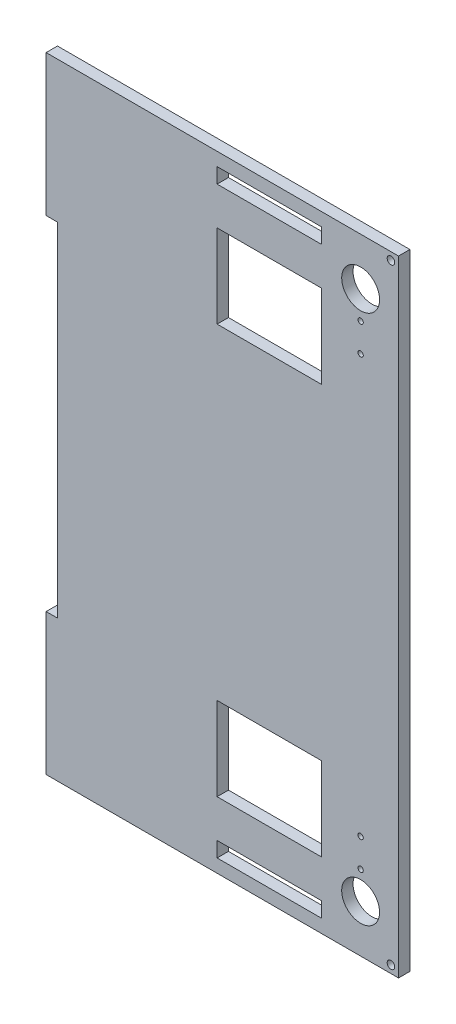
ISO-10303-21;
HEADER;
FILE_DESCRIPTION(('STEP AP214'),'2;1');
FILE_NAME('part.step','',(''),(''),'','','');
FILE_SCHEMA(('AUTOMOTIVE_DESIGN { 1 0 10303 214 1 1 1 1 }'));
ENDSEC;
DATA;
#1=APPLICATION_CONTEXT('core data for automotive mechanical design processes');
#2=APPLICATION_PROTOCOL_DEFINITION('international standard','automotive_design',2000,#1);
#3=PRODUCT_CONTEXT('',#1,'mechanical');
#4=PRODUCT('Part','Part','',(#3));
#5=PRODUCT_RELATED_PRODUCT_CATEGORY('part','',(#4));
#6=PRODUCT_DEFINITION_FORMATION('','',#4);
#7=PRODUCT_DEFINITION_CONTEXT('part definition',#1,'design');
#8=PRODUCT_DEFINITION('design','',#6,#7);
#9=PRODUCT_DEFINITION_SHAPE('','',#8);
#10=(LENGTH_UNIT() NAMED_UNIT(*) SI_UNIT(.MILLI.,.METRE.));
#11=(NAMED_UNIT(*) PLANE_ANGLE_UNIT() SI_UNIT($,.RADIAN.));
#12=(NAMED_UNIT(*) SI_UNIT($,.STERADIAN.) SOLID_ANGLE_UNIT());
#13=UNCERTAINTY_MEASURE_WITH_UNIT(LENGTH_MEASURE(1.E-05),#10,'distance_accuracy_value','');
#14=(GEOMETRIC_REPRESENTATION_CONTEXT(3) GLOBAL_UNCERTAINTY_ASSIGNED_CONTEXT((#13)) GLOBAL_UNIT_ASSIGNED_CONTEXT((#10,
#11,#12)) REPRESENTATION_CONTEXT('',''));
#15=CARTESIAN_POINT('',(0.,0.,0.));
#16=DIRECTION('',(0.,0.,1.));
#17=DIRECTION('',(1.,0.,0.));
#18=AXIS2_PLACEMENT_3D('',#15,#16,#17);
#19=CARTESIAN_POINT('',(-186.,0.,6.));
#20=DIRECTION('',(1.,0.,0.));
#21=DIRECTION('',(0.,1.,0.));
#22=AXIS2_PLACEMENT_3D('',#19,#20,#21);
#23=PLANE('',#22);
#24=DIRECTION('',(0.,-1.,0.));
#25=VECTOR('',#24,1.);
#26=CARTESIAN_POINT('',(-186.,0.,6.));
#27=LINE('',#26,#25);
#28=CARTESIAN_POINT('',(-186.,74.5,6.));
#29=VERTEX_POINT('',#28);
#30=CARTESIAN_POINT('',(-186.,0.,6.));
#31=VERTEX_POINT('',#30);
#32=EDGE_CURVE('E220',#29,#31,#27,.T.);
#33=ORIENTED_EDGE('',*,*,#32,.F.);
#34=DIRECTION('',(0.,0.,-1.));
#35=VECTOR('',#34,1.);
#36=CARTESIAN_POINT('',(-186.,74.5,6.));
#37=LINE('',#36,#35);
#38=CARTESIAN_POINT('',(-186.,74.5,0.));
#39=VERTEX_POINT('',#38);
#40=EDGE_CURVE('E258',#29,#39,#37,.T.);
#41=ORIENTED_EDGE('',*,*,#40,.T.);
#42=DIRECTION('',(0.,-1.,0.));
#43=VECTOR('',#42,1.);
#44=CARTESIAN_POINT('',(-186.,0.,0.));
#45=LINE('',#44,#43);
#46=CARTESIAN_POINT('',(-186.,0.,0.));
#47=VERTEX_POINT('',#46);
#48=EDGE_CURVE('E233',#39,#47,#45,.T.);
#49=ORIENTED_EDGE('',*,*,#48,.T.);
#50=DIRECTION('',(0.,0.,-1.));
#51=VECTOR('',#50,1.);
#52=CARTESIAN_POINT('',(-186.,0.,6.));
#53=LINE('',#52,#51);
#54=EDGE_CURVE('E240',#31,#47,#53,.T.);
#55=ORIENTED_EDGE('',*,*,#54,.F.);
#56=EDGE_LOOP('',(#33,#41,#49,#55));
#57=FACE_BOUND('',#56,.T.);
#58=ADVANCED_FACE('F33',(#57),#23,.F.);
#59=CARTESIAN_POINT('',(0.,0.,6.));
#60=DIRECTION('',(-1.,0.,0.));
#61=DIRECTION('',(0.,0.,1.));
#62=AXIS2_PLACEMENT_3D('',#59,#60,#61);
#63=PLANE('',#62);
#64=DIRECTION('',(0.,1.,0.));
#65=VECTOR('',#64,1.);
#66=CARTESIAN_POINT('',(0.,0.,0.));
#67=LINE('',#66,#65);
#68=CARTESIAN_POINT('',(0.,0.,0.));
#69=VERTEX_POINT('',#68);
#70=CARTESIAN_POINT('',(0.,330.,0.));
#71=VERTEX_POINT('',#70);
#72=EDGE_CURVE('E227',#69,#71,#67,.T.);
#73=ORIENTED_EDGE('',*,*,#72,.T.);
#74=DIRECTION('',(0.,0.,-1.));
#75=VECTOR('',#74,1.);
#76=CARTESIAN_POINT('',(0.,330.,6.));
#77=LINE('',#76,#75);
#78=CARTESIAN_POINT('',(0.,330.,6.));
#79=VERTEX_POINT('',#78);
#80=EDGE_CURVE('E11',#79,#71,#77,.T.);
#81=ORIENTED_EDGE('',*,*,#80,.F.);
#82=DIRECTION('',(0.,1.,0.));
#83=VECTOR('',#82,1.);
#84=CARTESIAN_POINT('',(0.,0.,6.));
#85=LINE('',#84,#83);
#86=CARTESIAN_POINT('',(0.,0.,6.));
#87=VERTEX_POINT('',#86);
#88=EDGE_CURVE('E237',#87,#79,#85,.T.);
#89=ORIENTED_EDGE('',*,*,#88,.F.);
#90=DIRECTION('',(0.,0.,-1.));
#91=VECTOR('',#90,1.);
#92=CARTESIAN_POINT('',(0.,0.,6.));
#93=LINE('',#92,#91);
#94=EDGE_CURVE('E222',#87,#69,#93,.T.);
#95=ORIENTED_EDGE('',*,*,#94,.T.);
#96=EDGE_LOOP('',(#73,#81,#89,#95));
#97=FACE_BOUND('',#96,.T.);
#98=ADVANCED_FACE('F35',(#97),#63,.F.);
#99=CARTESIAN_POINT('',(0.,330.,6.));
#100=DIRECTION('',(0.,-1.,0.));
#101=DIRECTION('',(1.,0.,0.));
#102=AXIS2_PLACEMENT_3D('',#99,#100,#101);
#103=PLANE('',#102);
#104=DIRECTION('',(-1.,0.,0.));
#105=VECTOR('',#104,1.);
#106=CARTESIAN_POINT('',(0.,330.,0.));
#107=LINE('',#106,#105);
#108=CARTESIAN_POINT('',(-186.,330.,0.));
#109=VERTEX_POINT('',#108);
#110=EDGE_CURVE('E230',#71,#109,#107,.T.);
#111=ORIENTED_EDGE('',*,*,#110,.T.);
#112=DIRECTION('',(0.,0.,-1.));
#113=VECTOR('',#112,1.);
#114=CARTESIAN_POINT('',(-186.,330.,6.));
#115=LINE('',#114,#113);
#116=CARTESIAN_POINT('',(-186.,330.,6.));
#117=VERTEX_POINT('',#116);
#118=EDGE_CURVE('E41',#117,#109,#115,.T.);
#119=ORIENTED_EDGE('',*,*,#118,.F.);
#120=DIRECTION('',(-1.,0.,0.));
#121=VECTOR('',#120,1.);
#122=CARTESIAN_POINT('',(0.,330.,6.));
#123=LINE('',#122,#121);
#124=EDGE_CURVE('E217',#79,#117,#123,.T.);
#125=ORIENTED_EDGE('',*,*,#124,.F.);
#126=ORIENTED_EDGE('',*,*,#80,.T.);
#127=EDGE_LOOP('',(#111,#119,#125,#126));
#128=FACE_BOUND('',#127,.T.);
#129=ADVANCED_FACE('F441',(#128),#103,.F.);
#130=CARTESIAN_POINT('',(-186.,255.5,0.));
#131=VERTEX_POINT('',#130);
#132=EDGE_CURVE('E210',#109,#131,#45,.T.);
#133=ORIENTED_EDGE('',*,*,#132,.T.);
#134=DIRECTION('',(0.,0.,-1.));
#135=VECTOR('',#134,1.);
#136=CARTESIAN_POINT('',(-186.,255.5,6.));
#137=LINE('',#136,#135);
#138=CARTESIAN_POINT('',(-186.,255.5,6.));
#139=VERTEX_POINT('',#138);
#140=EDGE_CURVE('E48',#139,#131,#137,.T.);
#141=ORIENTED_EDGE('',*,*,#140,.F.);
#142=EDGE_CURVE('E208',#117,#139,#27,.T.);
#143=ORIENTED_EDGE('',*,*,#142,.F.);
#144=ORIENTED_EDGE('',*,*,#118,.T.);
#145=EDGE_LOOP('',(#133,#141,#143,#144));
#146=FACE_BOUND('',#145,.T.);
#147=ADVANCED_FACE('F206',(#146),#23,.F.);
#148=CARTESIAN_POINT('',(0.,0.,6.));
#149=DIRECTION('',(0.,1.,0.));
#150=DIRECTION('',(-1.,0.,0.));
#151=AXIS2_PLACEMENT_3D('',#148,#149,#150);
#152=PLANE('',#151);
#153=DIRECTION('',(1.,0.,0.));
#154=VECTOR('',#153,1.);
#155=CARTESIAN_POINT('',(0.,0.,0.));
#156=LINE('',#155,#154);
#157=EDGE_CURVE('E235',#47,#69,#156,.T.);
#158=ORIENTED_EDGE('',*,*,#157,.T.);
#159=ORIENTED_EDGE('',*,*,#94,.F.);
#160=DIRECTION('',(1.,0.,0.));
#161=VECTOR('',#160,1.);
#162=CARTESIAN_POINT('',(0.,0.,6.));
#163=LINE('',#162,#161);
#164=EDGE_CURVE('E219',#31,#87,#163,.T.);
#165=ORIENTED_EDGE('',*,*,#164,.F.);
#166=ORIENTED_EDGE('',*,*,#54,.T.);
#167=EDGE_LOOP('',(#158,#159,#165,#166));
#168=FACE_BOUND('',#167,.T.);
#169=ADVANCED_FACE('F447',(#168),#152,.F.);
#170=CARTESIAN_POINT('',(0.,0.,6.));
#171=DIRECTION('',(0.,0.,1.));
#172=DIRECTION('',(1.,0.,0.));
#173=AXIS2_PLACEMENT_3D('',#170,#171,#172);
#174=PLANE('',#173);
#175=DIRECTION('',(-1.,0.,0.));
#176=VECTOR('',#175,1.);
#177=CARTESIAN_POINT('',(-186.,74.5,6.));
#178=LINE('',#177,#176);
#179=CARTESIAN_POINT('',(-180.,74.5,6.));
#180=VERTEX_POINT('',#179);
#181=EDGE_CURVE('E211',#180,#29,#178,.T.);
#182=ORIENTED_EDGE('',*,*,#181,.T.);
#183=ORIENTED_EDGE('',*,*,#32,.T.);
#184=ORIENTED_EDGE('',*,*,#164,.T.);
#185=ORIENTED_EDGE('',*,*,#88,.T.);
#186=ORIENTED_EDGE('',*,*,#124,.T.);
#187=ORIENTED_EDGE('',*,*,#142,.T.);
#188=DIRECTION('',(1.,0.,0.));
#189=VECTOR('',#188,1.);
#190=CARTESIAN_POINT('',(-186.,255.5,6.));
#191=LINE('',#190,#189);
#192=CARTESIAN_POINT('',(-180.,255.5,6.));
#193=VERTEX_POINT('',#192);
#194=EDGE_CURVE('E193',#139,#193,#191,.T.);
#195=ORIENTED_EDGE('',*,*,#194,.T.);
#196=DIRECTION('',(0.,-1.,0.));
#197=VECTOR('',#196,1.);
#198=CARTESIAN_POINT('',(-180.,74.5,6.));
#199=LINE('',#198,#197);
#200=EDGE_CURVE('E200',#193,#180,#199,.T.);
#201=ORIENTED_EDGE('',*,*,#200,.T.);
#202=EDGE_LOOP('',(#182,#183,#184,#185,#186,#187,#195,#201));
#203=FACE_BOUND('',#202,.T.);
#204=DIRECTION('',(1.,0.,0.));
#205=VECTOR('',#204,1.);
#206=CARTESIAN_POINT('',(-95.75,315.,6.));
#207=LINE('',#206,#205);
#208=CARTESIAN_POINT('',(-95.75,315.,6.));
#209=VERTEX_POINT('',#208);
#210=CARTESIAN_POINT('',(-40.75,315.,6.));
#211=VERTEX_POINT('',#210);
#212=EDGE_CURVE('E56',#209,#211,#207,.T.);
#213=ORIENTED_EDGE('',*,*,#212,.F.);
#214=DIRECTION('',(0.,-1.,0.));
#215=VECTOR('',#214,1.);
#216=CARTESIAN_POINT('',(-95.75,315.,6.));
#217=LINE('',#216,#215);
#218=CARTESIAN_POINT('',(-95.75,323.,6.));
#219=VERTEX_POINT('',#218);
#220=EDGE_CURVE('E268',#219,#209,#217,.T.);
#221=ORIENTED_EDGE('',*,*,#220,.F.);
#222=DIRECTION('',(-1.,0.,0.));
#223=VECTOR('',#222,1.);
#224=CARTESIAN_POINT('',(-95.75,323.,6.));
#225=LINE('',#224,#223);
#226=CARTESIAN_POINT('',(-40.75,323.,6.));
#227=VERTEX_POINT('',#226);
#228=EDGE_CURVE('E282',#227,#219,#225,.T.);
#229=ORIENTED_EDGE('',*,*,#228,.F.);
#230=DIRECTION('',(0.,1.,0.));
#231=VECTOR('',#230,1.);
#232=CARTESIAN_POINT('',(-40.75,315.,6.));
#233=LINE('',#232,#231);
#234=EDGE_CURVE('E279',#211,#227,#233,.T.);
#235=ORIENTED_EDGE('',*,*,#234,.F.);
#236=EDGE_LOOP('',(#213,#221,#229,#235));
#237=FACE_BOUND('',#236,.T.);
#238=CARTESIAN_POINT('',(-20.,305.,6.));
#239=DIRECTION('',(0.,0.,1.));
#240=DIRECTION('',(-1.,0.,0.));
#241=AXIS2_PLACEMENT_3D('',#238,#239,#240);
#242=CIRCLE('',#241,10.);
#243=CARTESIAN_POINT('',(-30.,305.,6.));
#244=VERTEX_POINT('',#243);
#245=EDGE_CURVE('E289',#244,#244,#242,.T.);
#246=ORIENTED_EDGE('',*,*,#245,.F.);
#247=EDGE_LOOP('',(#246));
#248=FACE_BOUND('',#247,.T.);
#249=CARTESIAN_POINT('',(-4.,326.,6.));
#250=DIRECTION('',(0.,0.,1.));
#251=DIRECTION('',(-1.,0.,0.));
#252=AXIS2_PLACEMENT_3D('',#249,#250,#251);
#253=CIRCLE('',#252,2.);
#254=CARTESIAN_POINT('',(-6.,326.,6.));
#255=VERTEX_POINT('',#254);
#256=EDGE_CURVE('E298',#255,#255,#253,.T.);
#257=ORIENTED_EDGE('',*,*,#256,.F.);
#258=EDGE_LOOP('',(#257));
#259=FACE_BOUND('',#258,.T.);
#260=CARTESIAN_POINT('',(-20.,290.27,6.));
#261=DIRECTION('',(0.,0.,1.));
#262=DIRECTION('',(-1.,0.,0.));
#263=AXIS2_PLACEMENT_3D('',#260,#261,#262);
#264=CIRCLE('',#263,1.4);
#265=CARTESIAN_POINT('',(-21.4,290.27,6.));
#266=VERTEX_POINT('',#265);
#267=EDGE_CURVE('E304',#266,#266,#264,.T.);
#268=ORIENTED_EDGE('',*,*,#267,.F.);
#269=EDGE_LOOP('',(#268));
#270=FACE_BOUND('',#269,.T.);
#271=CARTESIAN_POINT('',(-20.,275.27,6.));
#272=DIRECTION('',(0.,0.,1.));
#273=DIRECTION('',(-1.,0.,0.));
#274=AXIS2_PLACEMENT_3D('',#271,#272,#273);
#275=CIRCLE('',#274,1.4);
#276=CARTESIAN_POINT('',(-21.4,275.27,6.));
#277=VERTEX_POINT('',#276);
#278=EDGE_CURVE('E310',#277,#277,#275,.T.);
#279=ORIENTED_EDGE('',*,*,#278,.F.);
#280=EDGE_LOOP('',(#279));
#281=FACE_BOUND('',#280,.T.);
#282=DIRECTION('',(0.,-1.,0.));
#283=VECTOR('',#282,1.);
#284=CARTESIAN_POINT('',(-95.75,251.,6.));
#285=LINE('',#284,#283);
#286=CARTESIAN_POINT('',(-95.75,295.,6.));
#287=VERTEX_POINT('',#286);
#288=CARTESIAN_POINT('',(-95.75,251.,6.));
#289=VERTEX_POINT('',#288);
#290=EDGE_CURVE('E316',#287,#289,#285,.T.);
#291=ORIENTED_EDGE('',*,*,#290,.F.);
#292=DIRECTION('',(-1.,0.,0.));
#293=VECTOR('',#292,1.);
#294=CARTESIAN_POINT('',(-95.75,295.,6.));
#295=LINE('',#294,#293);
#296=CARTESIAN_POINT('',(-40.75,295.,6.));
#297=VERTEX_POINT('',#296);
#298=EDGE_CURVE('E323',#297,#287,#295,.T.);
#299=ORIENTED_EDGE('',*,*,#298,.F.);
#300=DIRECTION('',(0.,1.,0.));
#301=VECTOR('',#300,1.);
#302=CARTESIAN_POINT('',(-40.75,251.,6.));
#303=LINE('',#302,#301);
#304=CARTESIAN_POINT('',(-40.75,251.,6.));
#305=VERTEX_POINT('',#304);
#306=EDGE_CURVE('E337',#305,#297,#303,.T.);
#307=ORIENTED_EDGE('',*,*,#306,.F.);
#308=DIRECTION('',(1.,0.,0.));
#309=VECTOR('',#308,1.);
#310=CARTESIAN_POINT('',(-95.75,251.,6.));
#311=LINE('',#310,#309);
#312=EDGE_CURVE('E334',#289,#305,#311,.T.);
#313=ORIENTED_EDGE('',*,*,#312,.F.);
#314=EDGE_LOOP('',(#291,#299,#307,#313));
#315=FACE_BOUND('',#314,.T.);
#316=CARTESIAN_POINT('',(-20.,54.73,6.));
#317=DIRECTION('',(0.,0.,1.));
#318=DIRECTION('',(1.,0.,0.));
#319=AXIS2_PLACEMENT_3D('',#316,#317,#318);
#320=CIRCLE('',#319,1.4);
#321=CARTESIAN_POINT('',(-18.6,54.73,6.));
#322=VERTEX_POINT('',#321);
#323=EDGE_CURVE('E344',#322,#322,#320,.T.);
#324=ORIENTED_EDGE('',*,*,#323,.F.);
#325=EDGE_LOOP('',(#324));
#326=FACE_BOUND('',#325,.T.);
#327=CARTESIAN_POINT('',(-20.,39.73,6.));
#328=DIRECTION('',(0.,0.,1.));
#329=DIRECTION('',(1.,0.,0.));
#330=AXIS2_PLACEMENT_3D('',#327,#328,#329);
#331=CIRCLE('',#330,1.4);
#332=CARTESIAN_POINT('',(-18.6,39.73,6.));
#333=VERTEX_POINT('',#332);
#334=EDGE_CURVE('E354',#333,#333,#331,.T.);
#335=ORIENTED_EDGE('',*,*,#334,.F.);
#336=EDGE_LOOP('',(#335));
#337=FACE_BOUND('',#336,.T.);
#338=CARTESIAN_POINT('',(-20.,25.,6.));
#339=DIRECTION('',(0.,0.,1.));
#340=DIRECTION('',(1.,0.,0.));
#341=AXIS2_PLACEMENT_3D('',#338,#339,#340);
#342=CIRCLE('',#341,10.);
#343=CARTESIAN_POINT('',(-9.99999999999998,25.,6.));
#344=VERTEX_POINT('',#343);
#345=EDGE_CURVE('E360',#344,#344,#342,.T.);
#346=ORIENTED_EDGE('',*,*,#345,.F.);
#347=EDGE_LOOP('',(#346));
#348=FACE_BOUND('',#347,.T.);
#349=CARTESIAN_POINT('',(-4.,4.,6.));
#350=DIRECTION('',(0.,0.,1.));
#351=DIRECTION('',(1.,0.,0.));
#352=AXIS2_PLACEMENT_3D('',#349,#350,#351);
#353=CIRCLE('',#352,2.);
#354=CARTESIAN_POINT('',(-2.,4.,6.));
#355=VERTEX_POINT('',#354);
#356=EDGE_CURVE('E366',#355,#355,#353,.T.);
#357=ORIENTED_EDGE('',*,*,#356,.F.);
#358=EDGE_LOOP('',(#357));
#359=FACE_BOUND('',#358,.T.);
#360=DIRECTION('',(0.,-1.,0.));
#361=VECTOR('',#360,1.);
#362=CARTESIAN_POINT('',(-95.75,79.,6.));
#363=LINE('',#362,#361);
#364=CARTESIAN_POINT('',(-95.75,79.,6.));
#365=VERTEX_POINT('',#364);
#366=CARTESIAN_POINT('',(-95.75,35.,6.));
#367=VERTEX_POINT('',#366);
#368=EDGE_CURVE('E372',#365,#367,#363,.T.);
#369=ORIENTED_EDGE('',*,*,#368,.F.);
#370=DIRECTION('',(-1.,0.,0.));
#371=VECTOR('',#370,1.);
#372=CARTESIAN_POINT('',(-95.75,79.,6.));
#373=LINE('',#372,#371);
#374=CARTESIAN_POINT('',(-40.75,79.,6.));
#375=VERTEX_POINT('',#374);
#376=EDGE_CURVE('E379',#375,#365,#373,.T.);
#377=ORIENTED_EDGE('',*,*,#376,.F.);
#378=DIRECTION('',(0.,1.,0.));
#379=VECTOR('',#378,1.);
#380=CARTESIAN_POINT('',(-40.75,79.,6.));
#381=LINE('',#380,#379);
#382=CARTESIAN_POINT('',(-40.75,35.,6.));
#383=VERTEX_POINT('',#382);
#384=EDGE_CURVE('E393',#383,#375,#381,.T.);
#385=ORIENTED_EDGE('',*,*,#384,.F.);
#386=DIRECTION('',(1.,0.,0.));
#387=VECTOR('',#386,1.);
#388=CARTESIAN_POINT('',(-95.75,35.,6.));
#389=LINE('',#388,#387);
#390=EDGE_CURVE('E390',#367,#383,#389,.T.);
#391=ORIENTED_EDGE('',*,*,#390,.F.);
#392=EDGE_LOOP('',(#369,#377,#385,#391));
#393=FACE_BOUND('',#392,.T.);
#394=DIRECTION('',(0.,-1.,0.));
#395=VECTOR('',#394,1.);
#396=CARTESIAN_POINT('',(-95.75,15.,6.));
#397=LINE('',#396,#395);
#398=CARTESIAN_POINT('',(-95.75,15.,6.));
#399=VERTEX_POINT('',#398);
#400=CARTESIAN_POINT('',(-95.75,7.,6.));
#401=VERTEX_POINT('',#400);
#402=EDGE_CURVE('E400',#399,#401,#397,.T.);
#403=ORIENTED_EDGE('',*,*,#402,.F.);
#404=DIRECTION('',(-1.,0.,0.));
#405=VECTOR('',#404,1.);
#406=CARTESIAN_POINT('',(-95.75,15.,6.));
#407=LINE('',#406,#405);
#408=CARTESIAN_POINT('',(-40.75,15.,6.));
#409=VERTEX_POINT('',#408);
#410=EDGE_CURVE('E411',#409,#399,#407,.T.);
#411=ORIENTED_EDGE('',*,*,#410,.F.);
#412=DIRECTION('',(0.,1.,0.));
#413=VECTOR('',#412,1.);
#414=CARTESIAN_POINT('',(-40.75,15.,6.));
#415=LINE('',#414,#413);
#416=CARTESIAN_POINT('',(-40.75,7.,6.));
#417=VERTEX_POINT('',#416);
#418=EDGE_CURVE('E425',#417,#409,#415,.T.);
#419=ORIENTED_EDGE('',*,*,#418,.F.);
#420=DIRECTION('',(1.,0.,0.));
#421=VECTOR('',#420,1.);
#422=CARTESIAN_POINT('',(-95.75,7.,6.));
#423=LINE('',#422,#421);
#424=EDGE_CURVE('E422',#401,#417,#423,.T.);
#425=ORIENTED_EDGE('',*,*,#424,.F.);
#426=EDGE_LOOP('',(#403,#411,#419,#425));
#427=FACE_BOUND('',#426,.T.);
#428=ADVANCED_FACE('F214',(#203,#237,#248,#259,#270,#281,#315,#326,#337,#348,#359,#393,#427),
#174,.T.);
#429=CARTESIAN_POINT('',(0.,0.,0.));
#430=DIRECTION('',(0.,0.,1.));
#431=DIRECTION('',(1.,0.,0.));
#432=AXIS2_PLACEMENT_3D('',#429,#430,#431);
#433=PLANE('',#432);
#434=DIRECTION('',(0.,-1.,0.));
#435=VECTOR('',#434,1.);
#436=CARTESIAN_POINT('',(-95.75,315.,0.));
#437=LINE('',#436,#435);
#438=CARTESIAN_POINT('',(-95.75,323.,0.));
#439=VERTEX_POINT('',#438);
#440=CARTESIAN_POINT('',(-95.75,315.,0.));
#441=VERTEX_POINT('',#440);
#442=EDGE_CURVE('E274',#439,#441,#437,.T.);
#443=ORIENTED_EDGE('',*,*,#442,.T.);
#444=DIRECTION('',(1.,0.,0.));
#445=VECTOR('',#444,1.);
#446=CARTESIAN_POINT('',(-95.75,315.,0.));
#447=LINE('',#446,#445);
#448=CARTESIAN_POINT('',(-40.75,315.,0.));
#449=VERTEX_POINT('',#448);
#450=EDGE_CURVE('E264',#441,#449,#447,.T.);
#451=ORIENTED_EDGE('',*,*,#450,.T.);
#452=DIRECTION('',(0.,1.,0.));
#453=VECTOR('',#452,1.);
#454=CARTESIAN_POINT('',(-40.75,315.,0.));
#455=LINE('',#454,#453);
#456=CARTESIAN_POINT('',(-40.75,323.,0.));
#457=VERTEX_POINT('',#456);
#458=EDGE_CURVE('E267',#449,#457,#455,.T.);
#459=ORIENTED_EDGE('',*,*,#458,.T.);
#460=DIRECTION('',(-1.,0.,0.));
#461=VECTOR('',#460,1.);
#462=CARTESIAN_POINT('',(-95.75,323.,0.));
#463=LINE('',#462,#461);
#464=EDGE_CURVE('E271',#457,#439,#463,.T.);
#465=ORIENTED_EDGE('',*,*,#464,.T.);
#466=EDGE_LOOP('',(#443,#451,#459,#465));
#467=FACE_BOUND('',#466,.T.);
#468=CARTESIAN_POINT('',(-20.,305.,0.));
#469=DIRECTION('',(0.,0.,1.));
#470=DIRECTION('',(-1.,0.,0.));
#471=AXIS2_PLACEMENT_3D('',#468,#469,#470);
#472=CIRCLE('',#471,10.);
#473=CARTESIAN_POINT('',(-30.,305.,0.));
#474=VERTEX_POINT('',#473);
#475=EDGE_CURVE('E295',#474,#474,#472,.T.);
#476=ORIENTED_EDGE('',*,*,#475,.T.);
#477=EDGE_LOOP('',(#476));
#478=FACE_BOUND('',#477,.T.);
#479=CARTESIAN_POINT('',(-4.,326.,0.));
#480=DIRECTION('',(0.,0.,1.));
#481=DIRECTION('',(-1.,0.,0.));
#482=AXIS2_PLACEMENT_3D('',#479,#480,#481);
#483=CIRCLE('',#482,2.);
#484=CARTESIAN_POINT('',(-6.,326.,0.));
#485=VERTEX_POINT('',#484);
#486=EDGE_CURVE('E301',#485,#485,#483,.T.);
#487=ORIENTED_EDGE('',*,*,#486,.T.);
#488=EDGE_LOOP('',(#487));
#489=FACE_BOUND('',#488,.T.);
#490=CARTESIAN_POINT('',(-20.,290.27,0.));
#491=DIRECTION('',(0.,0.,1.));
#492=DIRECTION('',(-1.,0.,0.));
#493=AXIS2_PLACEMENT_3D('',#490,#491,#492);
#494=CIRCLE('',#493,1.4);
#495=CARTESIAN_POINT('',(-21.4,290.27,0.));
#496=VERTEX_POINT('',#495);
#497=EDGE_CURVE('E307',#496,#496,#494,.T.);
#498=ORIENTED_EDGE('',*,*,#497,.T.);
#499=EDGE_LOOP('',(#498));
#500=FACE_BOUND('',#499,.T.);
#501=CARTESIAN_POINT('',(-20.,275.27,0.));
#502=DIRECTION('',(0.,0.,1.));
#503=DIRECTION('',(-1.,0.,0.));
#504=AXIS2_PLACEMENT_3D('',#501,#502,#503);
#505=CIRCLE('',#504,1.4);
#506=CARTESIAN_POINT('',(-21.4,275.27,0.));
#507=VERTEX_POINT('',#506);
#508=EDGE_CURVE('E313',#507,#507,#505,.T.);
#509=ORIENTED_EDGE('',*,*,#508,.T.);
#510=EDGE_LOOP('',(#509));
#511=FACE_BOUND('',#510,.T.);
#512=DIRECTION('',(-1.,0.,0.));
#513=VECTOR('',#512,1.);
#514=CARTESIAN_POINT('',(-95.75,295.,0.));
#515=LINE('',#514,#513);
#516=CARTESIAN_POINT('',(-40.75,295.,0.));
#517=VERTEX_POINT('',#516);
#518=CARTESIAN_POINT('',(-95.75,295.,0.));
#519=VERTEX_POINT('',#518);
#520=EDGE_CURVE('E329',#517,#519,#515,.T.);
#521=ORIENTED_EDGE('',*,*,#520,.T.);
#522=DIRECTION('',(0.,-1.,0.));
#523=VECTOR('',#522,1.);
#524=CARTESIAN_POINT('',(-95.75,251.,0.));
#525=LINE('',#524,#523);
#526=CARTESIAN_POINT('',(-95.75,251.,0.));
#527=VERTEX_POINT('',#526);
#528=EDGE_CURVE('E319',#519,#527,#525,.T.);
#529=ORIENTED_EDGE('',*,*,#528,.T.);
#530=DIRECTION('',(1.,0.,0.));
#531=VECTOR('',#530,1.);
#532=CARTESIAN_POINT('',(-95.75,251.,0.));
#533=LINE('',#532,#531);
#534=CARTESIAN_POINT('',(-40.75,251.,0.));
#535=VERTEX_POINT('',#534);
#536=EDGE_CURVE('E322',#527,#535,#533,.T.);
#537=ORIENTED_EDGE('',*,*,#536,.T.);
#538=DIRECTION('',(0.,1.,0.));
#539=VECTOR('',#538,1.);
#540=CARTESIAN_POINT('',(-40.75,251.,0.));
#541=LINE('',#540,#539);
#542=EDGE_CURVE('E326',#535,#517,#541,.T.);
#543=ORIENTED_EDGE('',*,*,#542,.T.);
#544=EDGE_LOOP('',(#521,#529,#537,#543));
#545=FACE_BOUND('',#544,.T.);
#546=CARTESIAN_POINT('',(-20.,54.73,0.));
#547=DIRECTION('',(0.,0.,1.));
#548=DIRECTION('',(1.,0.,0.));
#549=AXIS2_PLACEMENT_3D('',#546,#547,#548);
#550=CIRCLE('',#549,1.4);
#551=CARTESIAN_POINT('',(-18.6,54.73,0.));
#552=VERTEX_POINT('',#551);
#553=EDGE_CURVE('E351',#552,#552,#550,.T.);
#554=ORIENTED_EDGE('',*,*,#553,.T.);
#555=EDGE_LOOP('',(#554));
#556=FACE_BOUND('',#555,.T.);
#557=CARTESIAN_POINT('',(-20.,39.73,0.));
#558=DIRECTION('',(0.,0.,1.));
#559=DIRECTION('',(1.,0.,0.));
#560=AXIS2_PLACEMENT_3D('',#557,#558,#559);
#561=CIRCLE('',#560,1.4);
#562=CARTESIAN_POINT('',(-18.6,39.73,0.));
#563=VERTEX_POINT('',#562);
#564=EDGE_CURVE('E357',#563,#563,#561,.T.);
#565=ORIENTED_EDGE('',*,*,#564,.T.);
#566=EDGE_LOOP('',(#565));
#567=FACE_BOUND('',#566,.T.);
#568=CARTESIAN_POINT('',(-20.,25.,0.));
#569=DIRECTION('',(0.,0.,1.));
#570=DIRECTION('',(1.,0.,0.));
#571=AXIS2_PLACEMENT_3D('',#568,#569,#570);
#572=CIRCLE('',#571,10.);
#573=CARTESIAN_POINT('',(-9.99999999999998,25.,0.));
#574=VERTEX_POINT('',#573);
#575=EDGE_CURVE('E363',#574,#574,#572,.T.);
#576=ORIENTED_EDGE('',*,*,#575,.T.);
#577=EDGE_LOOP('',(#576));
#578=FACE_BOUND('',#577,.T.);
#579=CARTESIAN_POINT('',(-4.,4.,0.));
#580=DIRECTION('',(0.,0.,1.));
#581=DIRECTION('',(1.,0.,0.));
#582=AXIS2_PLACEMENT_3D('',#579,#580,#581);
#583=CIRCLE('',#582,2.);
#584=CARTESIAN_POINT('',(-2.,4.,0.));
#585=VERTEX_POINT('',#584);
#586=EDGE_CURVE('E369',#585,#585,#583,.T.);
#587=ORIENTED_EDGE('',*,*,#586,.T.);
#588=EDGE_LOOP('',(#587));
#589=FACE_BOUND('',#588,.T.);
#590=DIRECTION('',(-1.,0.,0.));
#591=VECTOR('',#590,1.);
#592=CARTESIAN_POINT('',(-95.75,79.,0.));
#593=LINE('',#592,#591);
#594=CARTESIAN_POINT('',(-40.75,79.,0.));
#595=VERTEX_POINT('',#594);
#596=CARTESIAN_POINT('',(-95.75,79.,0.));
#597=VERTEX_POINT('',#596);
#598=EDGE_CURVE('E385',#595,#597,#593,.T.);
#599=ORIENTED_EDGE('',*,*,#598,.T.);
#600=DIRECTION('',(0.,-1.,0.));
#601=VECTOR('',#600,1.);
#602=CARTESIAN_POINT('',(-95.75,79.,0.));
#603=LINE('',#602,#601);
#604=CARTESIAN_POINT('',(-95.75,35.,0.));
#605=VERTEX_POINT('',#604);
#606=EDGE_CURVE('E375',#597,#605,#603,.T.);
#607=ORIENTED_EDGE('',*,*,#606,.T.);
#608=DIRECTION('',(1.,0.,0.));
#609=VECTOR('',#608,1.);
#610=CARTESIAN_POINT('',(-95.75,35.,0.));
#611=LINE('',#610,#609);
#612=CARTESIAN_POINT('',(-40.75,35.,0.));
#613=VERTEX_POINT('',#612);
#614=EDGE_CURVE('E378',#605,#613,#611,.T.);
#615=ORIENTED_EDGE('',*,*,#614,.T.);
#616=DIRECTION('',(0.,1.,0.));
#617=VECTOR('',#616,1.);
#618=CARTESIAN_POINT('',(-40.75,79.,0.));
#619=LINE('',#618,#617);
#620=EDGE_CURVE('E382',#613,#595,#619,.T.);
#621=ORIENTED_EDGE('',*,*,#620,.T.);
#622=EDGE_LOOP('',(#599,#607,#615,#621));
#623=FACE_BOUND('',#622,.T.);
#624=DIRECTION('',(-1.,0.,0.));
#625=VECTOR('',#624,1.);
#626=CARTESIAN_POINT('',(-95.75,15.,0.));
#627=LINE('',#626,#625);
#628=CARTESIAN_POINT('',(-40.75,15.,0.));
#629=VERTEX_POINT('',#628);
#630=CARTESIAN_POINT('',(-95.75,15.,0.));
#631=VERTEX_POINT('',#630);
#632=EDGE_CURVE('E417',#629,#631,#627,.T.);
#633=ORIENTED_EDGE('',*,*,#632,.T.);
#634=DIRECTION('',(0.,-1.,0.));
#635=VECTOR('',#634,1.);
#636=CARTESIAN_POINT('',(-95.75,15.,0.));
#637=LINE('',#636,#635);
#638=CARTESIAN_POINT('',(-95.75,7.,0.));
#639=VERTEX_POINT('',#638);
#640=EDGE_CURVE('E407',#631,#639,#637,.T.);
#641=ORIENTED_EDGE('',*,*,#640,.T.);
#642=DIRECTION('',(1.,0.,0.));
#643=VECTOR('',#642,1.);
#644=CARTESIAN_POINT('',(-95.75,7.,0.));
#645=LINE('',#644,#643);
#646=CARTESIAN_POINT('',(-40.75,7.,0.));
#647=VERTEX_POINT('',#646);
#648=EDGE_CURVE('E410',#639,#647,#645,.T.);
#649=ORIENTED_EDGE('',*,*,#648,.T.);
#650=DIRECTION('',(0.,1.,0.));
#651=VECTOR('',#650,1.);
#652=CARTESIAN_POINT('',(-40.75,15.,0.));
#653=LINE('',#652,#651);
#654=EDGE_CURVE('E414',#647,#629,#653,.T.);
#655=ORIENTED_EDGE('',*,*,#654,.T.);
#656=EDGE_LOOP('',(#633,#641,#649,#655));
#657=FACE_BOUND('',#656,.T.);
#658=ORIENTED_EDGE('',*,*,#48,.F.);
#659=DIRECTION('',(-1.,0.,0.));
#660=VECTOR('',#659,1.);
#661=CARTESIAN_POINT('',(-186.,74.5,0.));
#662=LINE('',#661,#660);
#663=CARTESIAN_POINT('',(-180.,74.5,0.));
#664=VERTEX_POINT('',#663);
#665=EDGE_CURVE('E201',#664,#39,#662,.T.);
#666=ORIENTED_EDGE('',*,*,#665,.F.);
#667=DIRECTION('',(0.,-1.,0.));
#668=VECTOR('',#667,1.);
#669=CARTESIAN_POINT('',(-180.,74.5,0.));
#670=LINE('',#669,#668);
#671=CARTESIAN_POINT('',(-180.,255.5,0.));
#672=VERTEX_POINT('',#671);
#673=EDGE_CURVE('E251',#672,#664,#670,.T.);
#674=ORIENTED_EDGE('',*,*,#673,.F.);
#675=DIRECTION('',(1.,0.,0.));
#676=VECTOR('',#675,1.);
#677=CARTESIAN_POINT('',(-186.,255.5,0.));
#678=LINE('',#677,#676);
#679=EDGE_CURVE('E248',#131,#672,#678,.T.);
#680=ORIENTED_EDGE('',*,*,#679,.F.);
#681=ORIENTED_EDGE('',*,*,#132,.F.);
#682=ORIENTED_EDGE('',*,*,#110,.F.);
#683=ORIENTED_EDGE('',*,*,#72,.F.);
#684=ORIENTED_EDGE('',*,*,#157,.F.);
#685=EDGE_LOOP('',(#658,#666,#674,#680,#681,#682,#683,#684));
#686=FACE_BOUND('',#685,.T.);
#687=ADVANCED_FACE('F245',(#467,#478,#489,#500,#511,#545,#556,#567,#578,#589,#623,#657,#686),
#433,.F.);
#688=CARTESIAN_POINT('',(-95.75,15.,0.));
#689=DIRECTION('',(-1.,0.,0.));
#690=DIRECTION('',(0.,0.,1.));
#691=AXIS2_PLACEMENT_3D('',#688,#689,#690);
#692=PLANE('',#691);
#693=ORIENTED_EDGE('',*,*,#402,.T.);
#694=DIRECTION('',(0.,0.,1.));
#695=VECTOR('',#694,1.);
#696=CARTESIAN_POINT('',(-95.75,7.,0.));
#697=LINE('',#696,#695);
#698=EDGE_CURVE('E420',#639,#401,#697,.T.);
#699=ORIENTED_EDGE('',*,*,#698,.F.);
#700=ORIENTED_EDGE('',*,*,#640,.F.);
#701=DIRECTION('',(0.,0.,1.));
#702=VECTOR('',#701,1.);
#703=CARTESIAN_POINT('',(-95.75,15.,0.));
#704=LINE('',#703,#702);
#705=EDGE_CURVE('E231',#631,#399,#704,.T.);
#706=ORIENTED_EDGE('',*,*,#705,.T.);
#707=EDGE_LOOP('',(#693,#699,#700,#706));
#708=FACE_BOUND('',#707,.T.);
#709=ADVANCED_FACE('F460',(#708),#692,.F.);
#710=CARTESIAN_POINT('',(-95.75,15.,0.));
#711=DIRECTION('',(0.,1.,0.));
#712=DIRECTION('',(0.,0.,1.));
#713=AXIS2_PLACEMENT_3D('',#710,#711,#712);
#714=PLANE('',#713);
#715=ORIENTED_EDGE('',*,*,#410,.T.);
#716=ORIENTED_EDGE('',*,*,#705,.F.);
#717=ORIENTED_EDGE('',*,*,#632,.F.);
#718=DIRECTION('',(0.,0.,1.));
#719=VECTOR('',#718,1.);
#720=CARTESIAN_POINT('',(-40.75,15.,0.));
#721=LINE('',#720,#719);
#722=EDGE_CURVE('E431',#629,#409,#721,.T.);
#723=ORIENTED_EDGE('',*,*,#722,.T.);
#724=EDGE_LOOP('',(#715,#716,#717,#723));
#725=FACE_BOUND('',#724,.T.);
#726=ADVANCED_FACE('F466',(#725),#714,.F.);
#727=CARTESIAN_POINT('',(-40.75,15.,0.));
#728=DIRECTION('',(1.,0.,0.));
#729=DIRECTION('',(0.,1.,0.));
#730=AXIS2_PLACEMENT_3D('',#727,#728,#729);
#731=PLANE('',#730);
#732=ORIENTED_EDGE('',*,*,#418,.T.);
#733=ORIENTED_EDGE('',*,*,#722,.F.);
#734=ORIENTED_EDGE('',*,*,#654,.F.);
#735=DIRECTION('',(0.,0.,1.));
#736=VECTOR('',#735,1.);
#737=CARTESIAN_POINT('',(-40.75,7.,0.));
#738=LINE('',#737,#736);
#739=EDGE_CURVE('E433',#647,#417,#738,.T.);
#740=ORIENTED_EDGE('',*,*,#739,.T.);
#741=EDGE_LOOP('',(#732,#733,#734,#740));
#742=FACE_BOUND('',#741,.T.);
#743=ADVANCED_FACE('F472',(#742),#731,.F.);
#744=CARTESIAN_POINT('',(-95.75,7.,0.));
#745=DIRECTION('',(0.,-1.,0.));
#746=DIRECTION('',(0.,0.,-1.));
#747=AXIS2_PLACEMENT_3D('',#744,#745,#746);
#748=PLANE('',#747);
#749=ORIENTED_EDGE('',*,*,#424,.T.);
#750=ORIENTED_EDGE('',*,*,#739,.F.);
#751=ORIENTED_EDGE('',*,*,#648,.F.);
#752=ORIENTED_EDGE('',*,*,#698,.T.);
#753=EDGE_LOOP('',(#749,#750,#751,#752));
#754=FACE_BOUND('',#753,.T.);
#755=ADVANCED_FACE('F468',(#754),#748,.F.);
#756=CARTESIAN_POINT('',(-95.75,79.,0.));
#757=DIRECTION('',(-1.,0.,0.));
#758=DIRECTION('',(0.,0.,1.));
#759=AXIS2_PLACEMENT_3D('',#756,#757,#758);
#760=PLANE('',#759);
#761=ORIENTED_EDGE('',*,*,#368,.T.);
#762=DIRECTION('',(0.,0.,1.));
#763=VECTOR('',#762,1.);
#764=CARTESIAN_POINT('',(-95.75,35.,0.));
#765=LINE('',#764,#763);
#766=EDGE_CURVE('E388',#605,#367,#765,.T.);
#767=ORIENTED_EDGE('',*,*,#766,.F.);
#768=ORIENTED_EDGE('',*,*,#606,.F.);
#769=DIRECTION('',(0.,0.,1.));
#770=VECTOR('',#769,1.);
#771=CARTESIAN_POINT('',(-95.75,79.,0.));
#772=LINE('',#771,#770);
#773=EDGE_CURVE('E398',#597,#365,#772,.T.);
#774=ORIENTED_EDGE('',*,*,#773,.T.);
#775=EDGE_LOOP('',(#761,#767,#768,#774));
#776=FACE_BOUND('',#775,.T.);
#777=ADVANCED_FACE('F471',(#776),#760,.F.);
#778=CARTESIAN_POINT('',(-95.75,79.,0.));
#779=DIRECTION('',(0.,1.,0.));
#780=DIRECTION('',(0.,0.,1.));
#781=AXIS2_PLACEMENT_3D('',#778,#779,#780);
#782=PLANE('',#781);
#783=ORIENTED_EDGE('',*,*,#376,.T.);
#784=ORIENTED_EDGE('',*,*,#773,.F.);
#785=ORIENTED_EDGE('',*,*,#598,.F.);
#786=DIRECTION('',(0.,0.,1.));
#787=VECTOR('',#786,1.);
#788=CARTESIAN_POINT('',(-40.75,79.,0.));
#789=LINE('',#788,#787);
#790=EDGE_CURVE('E401',#595,#375,#789,.T.);
#791=ORIENTED_EDGE('',*,*,#790,.T.);
#792=EDGE_LOOP('',(#783,#784,#785,#791));
#793=FACE_BOUND('',#792,.T.);
#794=ADVANCED_FACE('F482',(#793),#782,.F.);
#795=CARTESIAN_POINT('',(-40.75,79.,0.));
#796=DIRECTION('',(1.,0.,0.));
#797=DIRECTION('',(0.,1.,0.));
#798=AXIS2_PLACEMENT_3D('',#795,#796,#797);
#799=PLANE('',#798);
#800=ORIENTED_EDGE('',*,*,#384,.T.);
#801=ORIENTED_EDGE('',*,*,#790,.F.);
#802=ORIENTED_EDGE('',*,*,#620,.F.);
#803=DIRECTION('',(0.,0.,1.));
#804=VECTOR('',#803,1.);
#805=CARTESIAN_POINT('',(-40.75,35.,0.));
#806=LINE('',#805,#804);
#807=EDGE_CURVE('E403',#613,#383,#806,.T.);
#808=ORIENTED_EDGE('',*,*,#807,.T.);
#809=EDGE_LOOP('',(#800,#801,#802,#808));
#810=FACE_BOUND('',#809,.T.);
#811=ADVANCED_FACE('F488',(#810),#799,.F.);
#812=CARTESIAN_POINT('',(-95.75,35.,0.));
#813=DIRECTION('',(0.,-1.,0.));
#814=DIRECTION('',(0.,0.,-1.));
#815=AXIS2_PLACEMENT_3D('',#812,#813,#814);
#816=PLANE('',#815);
#817=ORIENTED_EDGE('',*,*,#390,.T.);
#818=ORIENTED_EDGE('',*,*,#807,.F.);
#819=ORIENTED_EDGE('',*,*,#614,.F.);
#820=ORIENTED_EDGE('',*,*,#766,.T.);
#821=EDGE_LOOP('',(#817,#818,#819,#820));
#822=FACE_BOUND('',#821,.T.);
#823=ADVANCED_FACE('F484',(#822),#816,.F.);
#824=CARTESIAN_POINT('',(-4.,4.,0.));
#825=DIRECTION('',(0.,0.,1.));
#826=DIRECTION('',(1.,0.,0.));
#827=AXIS2_PLACEMENT_3D('',#824,#825,#826);
#828=CYLINDRICAL_SURFACE('',#827,2.);
#829=ORIENTED_EDGE('',*,*,#586,.F.);
#830=EDGE_LOOP('',(#829));
#831=FACE_BOUND('',#830,.T.);
#832=ORIENTED_EDGE('',*,*,#356,.T.);
#833=EDGE_LOOP('',(#832));
#834=FACE_BOUND('',#833,.T.);
#835=ADVANCED_FACE('F487',(#831,#834),#828,.F.);
#836=CARTESIAN_POINT('',(-20.,25.,0.));
#837=DIRECTION('',(0.,0.,1.));
#838=DIRECTION('',(1.,0.,0.));
#839=AXIS2_PLACEMENT_3D('',#836,#837,#838);
#840=CYLINDRICAL_SURFACE('',#839,10.);
#841=ORIENTED_EDGE('',*,*,#575,.F.);
#842=EDGE_LOOP('',(#841));
#843=FACE_BOUND('',#842,.T.);
#844=ORIENTED_EDGE('',*,*,#345,.T.);
#845=EDGE_LOOP('',(#844));
#846=FACE_BOUND('',#845,.T.);
#847=ADVANCED_FACE('F498',(#843,#846),#840,.F.);
#848=CARTESIAN_POINT('',(-20.,39.73,0.));
#849=DIRECTION('',(0.,0.,1.));
#850=DIRECTION('',(1.,0.,0.));
#851=AXIS2_PLACEMENT_3D('',#848,#849,#850);
#852=CYLINDRICAL_SURFACE('',#851,1.4);
#853=ORIENTED_EDGE('',*,*,#564,.F.);
#854=EDGE_LOOP('',(#853));
#855=FACE_BOUND('',#854,.T.);
#856=ORIENTED_EDGE('',*,*,#334,.T.);
#857=EDGE_LOOP('',(#856));
#858=FACE_BOUND('',#857,.T.);
#859=ADVANCED_FACE('F502',(#855,#858),#852,.F.);
#860=CARTESIAN_POINT('',(-20.,54.73,0.));
#861=DIRECTION('',(0.,0.,1.));
#862=DIRECTION('',(1.,0.,0.));
#863=AXIS2_PLACEMENT_3D('',#860,#861,#862);
#864=CYLINDRICAL_SURFACE('',#863,1.4);
#865=ORIENTED_EDGE('',*,*,#553,.F.);
#866=EDGE_LOOP('',(#865));
#867=FACE_BOUND('',#866,.T.);
#868=ORIENTED_EDGE('',*,*,#323,.T.);
#869=EDGE_LOOP('',(#868));
#870=FACE_BOUND('',#869,.T.);
#871=ADVANCED_FACE('F506',(#867,#870),#864,.F.);
#872=CARTESIAN_POINT('',(-95.75,251.,0.));
#873=DIRECTION('',(-1.,0.,0.));
#874=DIRECTION('',(0.,0.,1.));
#875=AXIS2_PLACEMENT_3D('',#872,#873,#874);
#876=PLANE('',#875);
#877=ORIENTED_EDGE('',*,*,#290,.T.);
#878=DIRECTION('',(0.,0.,1.));
#879=VECTOR('',#878,1.);
#880=CARTESIAN_POINT('',(-95.75,251.,0.));
#881=LINE('',#880,#879);
#882=EDGE_CURVE('E332',#527,#289,#881,.T.);
#883=ORIENTED_EDGE('',*,*,#882,.F.);
#884=ORIENTED_EDGE('',*,*,#528,.F.);
#885=DIRECTION('',(0.,0.,1.));
#886=VECTOR('',#885,1.);
#887=CARTESIAN_POINT('',(-95.75,295.,0.));
#888=LINE('',#887,#886);
#889=EDGE_CURVE('E342',#519,#287,#888,.T.);
#890=ORIENTED_EDGE('',*,*,#889,.T.);
#891=EDGE_LOOP('',(#877,#883,#884,#890));
#892=FACE_BOUND('',#891,.T.);
#893=ADVANCED_FACE('F510',(#892),#876,.F.);
#894=CARTESIAN_POINT('',(-95.75,295.,0.));
#895=DIRECTION('',(0.,1.,0.));
#896=DIRECTION('',(0.,0.,1.));
#897=AXIS2_PLACEMENT_3D('',#894,#895,#896);
#898=PLANE('',#897);
#899=ORIENTED_EDGE('',*,*,#298,.T.);
#900=ORIENTED_EDGE('',*,*,#889,.F.);
#901=ORIENTED_EDGE('',*,*,#520,.F.);
#902=DIRECTION('',(0.,0.,1.));
#903=VECTOR('',#902,1.);
#904=CARTESIAN_POINT('',(-40.75,295.,0.));
#905=LINE('',#904,#903);
#906=EDGE_CURVE('E345',#517,#297,#905,.T.);
#907=ORIENTED_EDGE('',*,*,#906,.T.);
#908=EDGE_LOOP('',(#899,#900,#901,#907));
#909=FACE_BOUND('',#908,.T.);
#910=ADVANCED_FACE('F514',(#909),#898,.F.);
#911=CARTESIAN_POINT('',(-40.75,251.,0.));
#912=DIRECTION('',(1.,0.,0.));
#913=DIRECTION('',(0.,1.,0.));
#914=AXIS2_PLACEMENT_3D('',#911,#912,#913);
#915=PLANE('',#914);
#916=ORIENTED_EDGE('',*,*,#306,.T.);
#917=ORIENTED_EDGE('',*,*,#906,.F.);
#918=ORIENTED_EDGE('',*,*,#542,.F.);
#919=DIRECTION('',(0.,0.,1.));
#920=VECTOR('',#919,1.);
#921=CARTESIAN_POINT('',(-40.75,251.,0.));
#922=LINE('',#921,#920);
#923=EDGE_CURVE('E347',#535,#305,#922,.T.);
#924=ORIENTED_EDGE('',*,*,#923,.T.);
#925=EDGE_LOOP('',(#916,#917,#918,#924));
#926=FACE_BOUND('',#925,.T.);
#927=ADVANCED_FACE('F520',(#926),#915,.F.);
#928=CARTESIAN_POINT('',(-95.75,251.,0.));
#929=DIRECTION('',(0.,-1.,0.));
#930=DIRECTION('',(0.,0.,-1.));
#931=AXIS2_PLACEMENT_3D('',#928,#929,#930);
#932=PLANE('',#931);
#933=ORIENTED_EDGE('',*,*,#312,.T.);
#934=ORIENTED_EDGE('',*,*,#923,.F.);
#935=ORIENTED_EDGE('',*,*,#536,.F.);
#936=ORIENTED_EDGE('',*,*,#882,.T.);
#937=EDGE_LOOP('',(#933,#934,#935,#936));
#938=FACE_BOUND('',#937,.T.);
#939=ADVANCED_FACE('F516',(#938),#932,.F.);
#940=CARTESIAN_POINT('',(-20.,275.27,0.));
#941=DIRECTION('',(0.,0.,1.));
#942=DIRECTION('',(1.,0.,0.));
#943=AXIS2_PLACEMENT_3D('',#940,#941,#942);
#944=CYLINDRICAL_SURFACE('',#943,1.4);
#945=ORIENTED_EDGE('',*,*,#508,.F.);
#946=EDGE_LOOP('',(#945));
#947=FACE_BOUND('',#946,.T.);
#948=ORIENTED_EDGE('',*,*,#278,.T.);
#949=EDGE_LOOP('',(#948));
#950=FACE_BOUND('',#949,.T.);
#951=ADVANCED_FACE('F519',(#947,#950),#944,.F.);
#952=CARTESIAN_POINT('',(-20.,290.27,0.));
#953=DIRECTION('',(0.,0.,1.));
#954=DIRECTION('',(1.,0.,0.));
#955=AXIS2_PLACEMENT_3D('',#952,#953,#954);
#956=CYLINDRICAL_SURFACE('',#955,1.4);
#957=ORIENTED_EDGE('',*,*,#497,.F.);
#958=EDGE_LOOP('',(#957));
#959=FACE_BOUND('',#958,.T.);
#960=ORIENTED_EDGE('',*,*,#267,.T.);
#961=EDGE_LOOP('',(#960));
#962=FACE_BOUND('',#961,.T.);
#963=ADVANCED_FACE('F530',(#959,#962),#956,.F.);
#964=CARTESIAN_POINT('',(-4.,326.,0.));
#965=DIRECTION('',(0.,0.,1.));
#966=DIRECTION('',(1.,0.,0.));
#967=AXIS2_PLACEMENT_3D('',#964,#965,#966);
#968=CYLINDRICAL_SURFACE('',#967,2.);
#969=ORIENTED_EDGE('',*,*,#486,.F.);
#970=EDGE_LOOP('',(#969));
#971=FACE_BOUND('',#970,.T.);
#972=ORIENTED_EDGE('',*,*,#256,.T.);
#973=EDGE_LOOP('',(#972));
#974=FACE_BOUND('',#973,.T.);
#975=ADVANCED_FACE('F534',(#971,#974),#968,.F.);
#976=CARTESIAN_POINT('',(-20.,305.,0.));
#977=DIRECTION('',(0.,0.,1.));
#978=DIRECTION('',(1.,0.,0.));
#979=AXIS2_PLACEMENT_3D('',#976,#977,#978);
#980=CYLINDRICAL_SURFACE('',#979,10.);
#981=ORIENTED_EDGE('',*,*,#475,.F.);
#982=EDGE_LOOP('',(#981));
#983=FACE_BOUND('',#982,.T.);
#984=ORIENTED_EDGE('',*,*,#245,.T.);
#985=EDGE_LOOP('',(#984));
#986=FACE_BOUND('',#985,.T.);
#987=ADVANCED_FACE('F538',(#983,#986),#980,.F.);
#988=CARTESIAN_POINT('',(-95.75,315.,0.));
#989=DIRECTION('',(0.,-1.,0.));
#990=DIRECTION('',(0.,0.,-1.));
#991=AXIS2_PLACEMENT_3D('',#988,#989,#990);
#992=PLANE('',#991);
#993=ORIENTED_EDGE('',*,*,#212,.T.);
#994=DIRECTION('',(0.,0.,1.));
#995=VECTOR('',#994,1.);
#996=CARTESIAN_POINT('',(-40.75,315.,0.));
#997=LINE('',#996,#995);
#998=EDGE_CURVE('E277',#449,#211,#997,.T.);
#999=ORIENTED_EDGE('',*,*,#998,.F.);
#1000=ORIENTED_EDGE('',*,*,#450,.F.);
#1001=DIRECTION('',(0.,0.,1.));
#1002=VECTOR('',#1001,1.);
#1003=CARTESIAN_POINT('',(-95.75,315.,0.));
#1004=LINE('',#1003,#1002);
#1005=EDGE_CURVE('E287',#441,#209,#1004,.T.);
#1006=ORIENTED_EDGE('',*,*,#1005,.T.);
#1007=EDGE_LOOP('',(#993,#999,#1000,#1006));
#1008=FACE_BOUND('',#1007,.T.);
#1009=ADVANCED_FACE('F542',(#1008),#992,.F.);
#1010=CARTESIAN_POINT('',(-95.75,315.,0.));
#1011=DIRECTION('',(-1.,0.,0.));
#1012=DIRECTION('',(0.,0.,1.));
#1013=AXIS2_PLACEMENT_3D('',#1010,#1011,#1012);
#1014=PLANE('',#1013);
#1015=ORIENTED_EDGE('',*,*,#220,.T.);
#1016=ORIENTED_EDGE('',*,*,#1005,.F.);
#1017=ORIENTED_EDGE('',*,*,#442,.F.);
#1018=DIRECTION('',(0.,0.,1.));
#1019=VECTOR('',#1018,1.);
#1020=CARTESIAN_POINT('',(-95.75,323.,0.));
#1021=LINE('',#1020,#1019);
#1022=EDGE_CURVE('E290',#439,#219,#1021,.T.);
#1023=ORIENTED_EDGE('',*,*,#1022,.T.);
#1024=EDGE_LOOP('',(#1015,#1016,#1017,#1023));
#1025=FACE_BOUND('',#1024,.T.);
#1026=ADVANCED_FACE('F546',(#1025),#1014,.F.);
#1027=CARTESIAN_POINT('',(-95.75,323.,0.));
#1028=DIRECTION('',(0.,1.,0.));
#1029=DIRECTION('',(0.,0.,1.));
#1030=AXIS2_PLACEMENT_3D('',#1027,#1028,#1029);
#1031=PLANE('',#1030);
#1032=ORIENTED_EDGE('',*,*,#228,.T.);
#1033=ORIENTED_EDGE('',*,*,#1022,.F.);
#1034=ORIENTED_EDGE('',*,*,#464,.F.);
#1035=DIRECTION('',(0.,0.,1.));
#1036=VECTOR('',#1035,1.);
#1037=CARTESIAN_POINT('',(-40.75,323.,0.));
#1038=LINE('',#1037,#1036);
#1039=EDGE_CURVE('E292',#457,#227,#1038,.T.);
#1040=ORIENTED_EDGE('',*,*,#1039,.T.);
#1041=EDGE_LOOP('',(#1032,#1033,#1034,#1040));
#1042=FACE_BOUND('',#1041,.T.);
#1043=ADVANCED_FACE('F551',(#1042),#1031,.F.);
#1044=CARTESIAN_POINT('',(-40.75,315.,0.));
#1045=DIRECTION('',(1.,0.,0.));
#1046=DIRECTION('',(0.,1.,0.));
#1047=AXIS2_PLACEMENT_3D('',#1044,#1045,#1046);
#1048=PLANE('',#1047);
#1049=ORIENTED_EDGE('',*,*,#234,.T.);
#1050=ORIENTED_EDGE('',*,*,#1039,.F.);
#1051=ORIENTED_EDGE('',*,*,#458,.F.);
#1052=ORIENTED_EDGE('',*,*,#998,.T.);
#1053=EDGE_LOOP('',(#1049,#1050,#1051,#1052));
#1054=FACE_BOUND('',#1053,.T.);
#1055=ADVANCED_FACE('F547',(#1054),#1048,.F.);
#1056=CARTESIAN_POINT('',(-186.,74.5,6.));
#1057=DIRECTION('',(0.,-1.,0.));
#1058=DIRECTION('',(0.,0.,-1.));
#1059=AXIS2_PLACEMENT_3D('',#1056,#1057,#1058);
#1060=PLANE('',#1059);
#1061=ORIENTED_EDGE('',*,*,#665,.T.);
#1062=ORIENTED_EDGE('',*,*,#40,.F.);
#1063=ORIENTED_EDGE('',*,*,#181,.F.);
#1064=DIRECTION('',(0.,0.,-1.));
#1065=VECTOR('',#1064,1.);
#1066=CARTESIAN_POINT('',(-180.,74.5,6.));
#1067=LINE('',#1066,#1065);
#1068=EDGE_CURVE('E261',#180,#664,#1067,.T.);
#1069=ORIENTED_EDGE('',*,*,#1068,.T.);
#1070=EDGE_LOOP('',(#1061,#1062,#1063,#1069));
#1071=FACE_BOUND('',#1070,.T.);
#1072=ADVANCED_FACE('F550',(#1071),#1060,.F.);
#1073=CARTESIAN_POINT('',(-180.,74.5,6.));
#1074=DIRECTION('',(1.,0.,0.));
#1075=DIRECTION('',(0.,0.,-1.));
#1076=AXIS2_PLACEMENT_3D('',#1073,#1074,#1075);
#1077=PLANE('',#1076);
#1078=ORIENTED_EDGE('',*,*,#673,.T.);
#1079=ORIENTED_EDGE('',*,*,#1068,.F.);
#1080=ORIENTED_EDGE('',*,*,#200,.F.);
#1081=DIRECTION('',(0.,0.,-1.));
#1082=VECTOR('',#1081,1.);
#1083=CARTESIAN_POINT('',(-180.,255.5,6.));
#1084=LINE('',#1083,#1082);
#1085=EDGE_CURVE('E195',#193,#672,#1084,.T.);
#1086=ORIENTED_EDGE('',*,*,#1085,.T.);
#1087=EDGE_LOOP('',(#1078,#1079,#1080,#1086));
#1088=FACE_BOUND('',#1087,.T.);
#1089=ADVANCED_FACE('F561',(#1088),#1077,.F.);
#1090=CARTESIAN_POINT('',(-186.,255.5,6.));
#1091=DIRECTION('',(0.,1.,0.));
#1092=DIRECTION('',(0.,0.,1.));
#1093=AXIS2_PLACEMENT_3D('',#1090,#1091,#1092);
#1094=PLANE('',#1093);
#1095=ORIENTED_EDGE('',*,*,#679,.T.);
#1096=ORIENTED_EDGE('',*,*,#1085,.F.);
#1097=ORIENTED_EDGE('',*,*,#194,.F.);
#1098=ORIENTED_EDGE('',*,*,#140,.T.);
#1099=EDGE_LOOP('',(#1095,#1096,#1097,#1098));
#1100=FACE_BOUND('',#1099,.T.);
#1101=ADVANCED_FACE('F194',(#1100),#1094,.F.);
#1102=CLOSED_SHELL('',(#58,#98,#129,#147,#169,#428,#687,#709,#726,#743,#755,#777,#794,#811,#823,
#835,#847,#859,#871,#893,#910,#927,#939,#951,#963,#975,#987,#1009,#1026,#1043,#1055,#1072,#1089,#1101));
#1103=MANIFOLD_SOLID_BREP('B2',#1102);
#1104=ADVANCED_BREP_SHAPE_REPRESENTATION('',(#18,#1103),#14);
#1105=SHAPE_DEFINITION_REPRESENTATION(#9,#1104);
ENDSEC;
END-ISO-10303-21;
